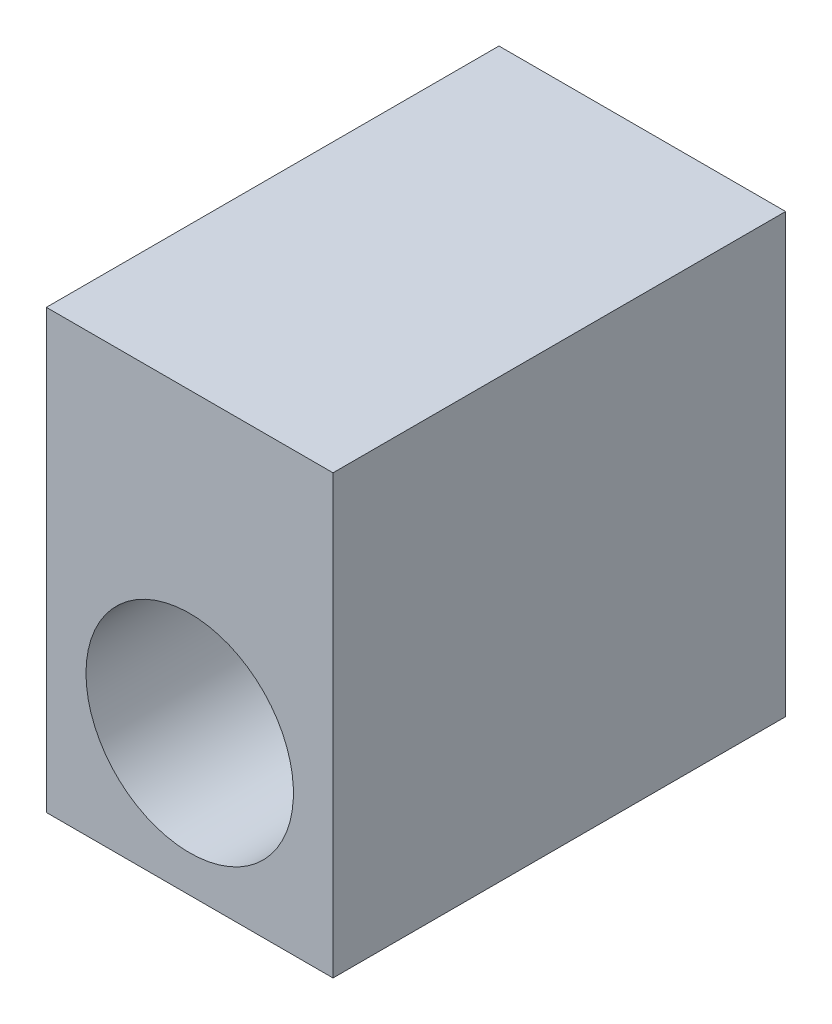
ISO-10303-21;
HEADER;
FILE_DESCRIPTION(('STEP AP214'),'2;1');
FILE_NAME('part.step','',(''),(''),'','','');
FILE_SCHEMA(('AUTOMOTIVE_DESIGN { 1 0 10303 214 1 1 1 1 }'));
ENDSEC;
DATA;
#1=APPLICATION_CONTEXT('core data for automotive mechanical design processes');
#2=APPLICATION_PROTOCOL_DEFINITION('international standard','automotive_design',2000,#1);
#3=PRODUCT_CONTEXT('',#1,'mechanical');
#4=PRODUCT('Part','Part','',(#3));
#5=PRODUCT_RELATED_PRODUCT_CATEGORY('part','',(#4));
#6=PRODUCT_DEFINITION_FORMATION('','',#4);
#7=PRODUCT_DEFINITION_CONTEXT('part definition',#1,'design');
#8=PRODUCT_DEFINITION('design','',#6,#7);
#9=PRODUCT_DEFINITION_SHAPE('','',#8);
#10=(LENGTH_UNIT() NAMED_UNIT(*) SI_UNIT(.MILLI.,.METRE.));
#11=(NAMED_UNIT(*) PLANE_ANGLE_UNIT() SI_UNIT($,.RADIAN.));
#12=(NAMED_UNIT(*) SI_UNIT($,.STERADIAN.) SOLID_ANGLE_UNIT());
#13=UNCERTAINTY_MEASURE_WITH_UNIT(LENGTH_MEASURE(1.E-05),#10,'distance_accuracy_value','');
#14=(GEOMETRIC_REPRESENTATION_CONTEXT(3) GLOBAL_UNCERTAINTY_ASSIGNED_CONTEXT((#13)) GLOBAL_UNIT_ASSIGNED_CONTEXT((#10,
#11,#12)) REPRESENTATION_CONTEXT('',''));
#15=CARTESIAN_POINT('',(0.,0.,0.));
#16=DIRECTION('',(0.,0.,1.));
#17=DIRECTION('',(1.,0.,0.));
#18=AXIS2_PLACEMENT_3D('',#15,#16,#17);
#19=CARTESIAN_POINT('',(-2.5,2.461607213756,3.250000059605));
#20=DIRECTION('',(0.,0.,-1.));
#21=DIRECTION('',(1.,0.,0.));
#22=AXIS2_PLACEMENT_3D('',#19,#20,#21);
#23=CYLINDRICAL_SURFACE('',#22,1.375);
#24=CARTESIAN_POINT('',(-2.5,2.461607213756,-2.749999940395));
#25=DIRECTION('',(0.,0.,1.));
#26=DIRECTION('',(1.,0.,0.));
#27=AXIS2_PLACEMENT_3D('',#24,#25,#26);
#28=CIRCLE('',#27,1.375);
#29=CARTESIAN_POINT('',(-3.875,2.461607213756,-2.749999940395));
#30=VERTEX_POINT('',#29);
#31=EDGE_CURVE('E11',#30,#30,#28,.T.);
#32=ORIENTED_EDGE('',*,*,#31,.F.);
#33=DIRECTION('',(0.,0.,1.));
#34=VECTOR('',#33,1.);
#35=CARTESIAN_POINT('',(-3.875,2.461607213756,3.250000059605));
#36=LINE('',#35,#34);
#37=CARTESIAN_POINT('',(-3.875,2.461607213756,3.250000059605));
#38=VERTEX_POINT('',#37);
#39=EDGE_CURVE('E24',#30,#38,#36,.T.);
#40=ORIENTED_EDGE('',*,*,#39,.T.);
#41=CARTESIAN_POINT('',(-2.5,2.461607213756,3.250000059605));
#42=DIRECTION('',(0.,0.,-1.));
#43=DIRECTION('',(1.,0.,0.));
#44=AXIS2_PLACEMENT_3D('',#41,#42,#43);
#45=CIRCLE('',#44,1.375);
#46=EDGE_CURVE('E103',#38,#38,#45,.T.);
#47=ORIENTED_EDGE('',*,*,#46,.F.);
#48=ORIENTED_EDGE('',*,*,#39,.F.);
#49=EDGE_LOOP('',(#32,#40,#47,#48));
#50=FACE_BOUND('',#49,.T.);
#51=ADVANCED_FACE('F17',(#50),#23,.F.);
#52=CARTESIAN_POINT('',(-4.4,0.6,3.250000059605));
#53=DIRECTION('',(-1.,0.,0.));
#54=DIRECTION('',(0.,1.,0.));
#55=AXIS2_PLACEMENT_3D('',#52,#53,#54);
#56=PLANE('',#55);
#57=DIRECTION('',(0.,1.,0.));
#58=VECTOR('',#57,1.);
#59=CARTESIAN_POINT('',(-4.4,0.6,3.250000059605));
#60=LINE('',#59,#58);
#61=CARTESIAN_POINT('',(-4.4,0.6,3.250000059605));
#62=VERTEX_POINT('',#61);
#63=CARTESIAN_POINT('',(-4.4,6.4,3.250000059605));
#64=VERTEX_POINT('',#63);
#65=EDGE_CURVE('E101',#62,#64,#60,.T.);
#66=ORIENTED_EDGE('',*,*,#65,.T.);
#67=DIRECTION('',(0.,0.,-1.));
#68=VECTOR('',#67,1.);
#69=CARTESIAN_POINT('',(-4.4,6.4,3.250000059605));
#70=LINE('',#69,#68);
#71=CARTESIAN_POINT('',(-4.4,6.4,-2.749999940395));
#72=VERTEX_POINT('',#71);
#73=EDGE_CURVE('E99',#64,#72,#70,.T.);
#74=ORIENTED_EDGE('',*,*,#73,.T.);
#75=DIRECTION('',(0.,1.,0.));
#76=VECTOR('',#75,1.);
#77=CARTESIAN_POINT('',(-4.4,0.6,-2.749999940395));
#78=LINE('',#77,#76);
#79=CARTESIAN_POINT('',(-4.4,0.6,-2.749999940395));
#80=VERTEX_POINT('',#79);
#81=EDGE_CURVE('E84',#80,#72,#78,.T.);
#82=ORIENTED_EDGE('',*,*,#81,.F.);
#83=DIRECTION('',(0.,0.,-1.));
#84=VECTOR('',#83,1.);
#85=CARTESIAN_POINT('',(-4.4,0.6,3.250000059605));
#86=LINE('',#85,#84);
#87=EDGE_CURVE('E95',#62,#80,#86,.T.);
#88=ORIENTED_EDGE('',*,*,#87,.F.);
#89=EDGE_LOOP('',(#66,#74,#82,#88));
#90=FACE_BOUND('',#89,.T.);
#91=ADVANCED_FACE('F107',(#90),#56,.T.);
#92=CARTESIAN_POINT('',(-0.6,0.6,3.250000059605));
#93=DIRECTION('',(0.,-1.,0.));
#94=DIRECTION('',(-1.,0.,0.));
#95=AXIS2_PLACEMENT_3D('',#92,#93,#94);
#96=PLANE('',#95);
#97=DIRECTION('',(-1.,0.,0.));
#98=VECTOR('',#97,1.);
#99=CARTESIAN_POINT('',(-0.6,0.6,3.250000059605));
#100=LINE('',#99,#98);
#101=CARTESIAN_POINT('',(-0.6,0.6,3.250000059605));
#102=VERTEX_POINT('',#101);
#103=EDGE_CURVE('E92',#102,#62,#100,.T.);
#104=ORIENTED_EDGE('',*,*,#103,.T.);
#105=ORIENTED_EDGE('',*,*,#87,.T.);
#106=DIRECTION('',(-1.,0.,0.));
#107=VECTOR('',#106,1.);
#108=CARTESIAN_POINT('',(-0.6,0.6,-2.749999940395));
#109=LINE('',#108,#107);
#110=CARTESIAN_POINT('',(-0.6,0.6,-2.749999940395));
#111=VERTEX_POINT('',#110);
#112=EDGE_CURVE('E90',#111,#80,#109,.T.);
#113=ORIENTED_EDGE('',*,*,#112,.F.);
#114=DIRECTION('',(0.,0.,-1.));
#115=VECTOR('',#114,1.);
#116=CARTESIAN_POINT('',(-0.6,0.6,3.250000059605));
#117=LINE('',#116,#115);
#118=EDGE_CURVE('E67',#102,#111,#117,.T.);
#119=ORIENTED_EDGE('',*,*,#118,.F.);
#120=EDGE_LOOP('',(#104,#105,#113,#119));
#121=FACE_BOUND('',#120,.T.);
#122=ADVANCED_FACE('F112',(#121),#96,.T.);
#123=CARTESIAN_POINT('',(-0.6,6.4,3.250000059605));
#124=DIRECTION('',(1.,0.,0.));
#125=DIRECTION('',(0.,-1.,0.));
#126=AXIS2_PLACEMENT_3D('',#123,#124,#125);
#127=PLANE('',#126);
#128=DIRECTION('',(0.,-1.,0.));
#129=VECTOR('',#128,1.);
#130=CARTESIAN_POINT('',(-0.6,6.4,3.250000059605));
#131=LINE('',#130,#129);
#132=CARTESIAN_POINT('',(-0.6,6.4,3.250000059605));
#133=VERTEX_POINT('',#132);
#134=EDGE_CURVE('E71',#133,#102,#131,.T.);
#135=ORIENTED_EDGE('',*,*,#134,.T.);
#136=ORIENTED_EDGE('',*,*,#118,.T.);
#137=DIRECTION('',(0.,-1.,0.));
#138=VECTOR('',#137,1.);
#139=CARTESIAN_POINT('',(-0.6,6.4,-2.749999940395));
#140=LINE('',#139,#138);
#141=CARTESIAN_POINT('',(-0.6,6.4,-2.749999940395));
#142=VERTEX_POINT('',#141);
#143=EDGE_CURVE('E60',#142,#111,#140,.T.);
#144=ORIENTED_EDGE('',*,*,#143,.F.);
#145=DIRECTION('',(0.,0.,-1.));
#146=VECTOR('',#145,1.);
#147=CARTESIAN_POINT('',(-0.6,6.4,3.250000059605));
#148=LINE('',#147,#146);
#149=EDGE_CURVE('E64',#133,#142,#148,.T.);
#150=ORIENTED_EDGE('',*,*,#149,.F.);
#151=EDGE_LOOP('',(#135,#136,#144,#150));
#152=FACE_BOUND('',#151,.T.);
#153=ADVANCED_FACE('F63',(#152),#127,.T.);
#154=CARTESIAN_POINT('',(-4.4,6.4,3.250000059605));
#155=DIRECTION('',(0.,1.,0.));
#156=DIRECTION('',(1.,0.,0.));
#157=AXIS2_PLACEMENT_3D('',#154,#155,#156);
#158=PLANE('',#157);
#159=DIRECTION('',(1.,0.,0.));
#160=VECTOR('',#159,1.);
#161=CARTESIAN_POINT('',(-4.4,6.4,3.250000059605));
#162=LINE('',#161,#160);
#163=EDGE_CURVE('E79',#64,#133,#162,.T.);
#164=ORIENTED_EDGE('',*,*,#163,.T.);
#165=ORIENTED_EDGE('',*,*,#149,.T.);
#166=DIRECTION('',(1.,0.,0.));
#167=VECTOR('',#166,1.);
#168=CARTESIAN_POINT('',(-4.4,6.4,-2.749999940395));
#169=LINE('',#168,#167);
#170=EDGE_CURVE('E77',#72,#142,#169,.T.);
#171=ORIENTED_EDGE('',*,*,#170,.F.);
#172=ORIENTED_EDGE('',*,*,#73,.F.);
#173=EDGE_LOOP('',(#164,#165,#171,#172));
#174=FACE_BOUND('',#173,.T.);
#175=ADVANCED_FACE('F75',(#174),#158,.T.);
#176=CARTESIAN_POINT('',(-2.5,3.5,3.250000059605));
#177=DIRECTION('',(0.,0.,1.));
#178=DIRECTION('',(1.,0.,0.));
#179=AXIS2_PLACEMENT_3D('',#176,#177,#178);
#180=PLANE('',#179);
#181=ORIENTED_EDGE('',*,*,#163,.F.);
#182=ORIENTED_EDGE('',*,*,#65,.F.);
#183=ORIENTED_EDGE('',*,*,#103,.F.);
#184=ORIENTED_EDGE('',*,*,#134,.F.);
#185=EDGE_LOOP('',(#181,#182,#183,#184));
#186=FACE_BOUND('',#185,.T.);
#187=ORIENTED_EDGE('',*,*,#46,.T.);
#188=EDGE_LOOP('',(#187));
#189=FACE_BOUND('',#188,.T.);
#190=ADVANCED_FACE('F105',(#186,#189),#180,.T.);
#191=CARTESIAN_POINT('',(-2.5,3.5,-2.749999940395));
#192=DIRECTION('',(0.,0.,1.));
#193=DIRECTION('',(1.,0.,0.));
#194=AXIS2_PLACEMENT_3D('',#191,#192,#193);
#195=PLANE('',#194);
#196=ORIENTED_EDGE('',*,*,#170,.T.);
#197=ORIENTED_EDGE('',*,*,#143,.T.);
#198=ORIENTED_EDGE('',*,*,#112,.T.);
#199=ORIENTED_EDGE('',*,*,#81,.T.);
#200=EDGE_LOOP('',(#196,#197,#198,#199));
#201=FACE_BOUND('',#200,.T.);
#202=ORIENTED_EDGE('',*,*,#31,.T.);
#203=EDGE_LOOP('',(#202));
#204=FACE_BOUND('',#203,.T.);
#205=ADVANCED_FACE('F82',(#201,#204),#195,.F.);
#206=CLOSED_SHELL('',(#51,#91,#122,#153,#175,#190,#205));
#207=MANIFOLD_SOLID_BREP('B1',#206);
#208=ADVANCED_BREP_SHAPE_REPRESENTATION('',(#18,#207),#14);
#209=SHAPE_DEFINITION_REPRESENTATION(#9,#208);
ENDSEC;
END-ISO-10303-21;
